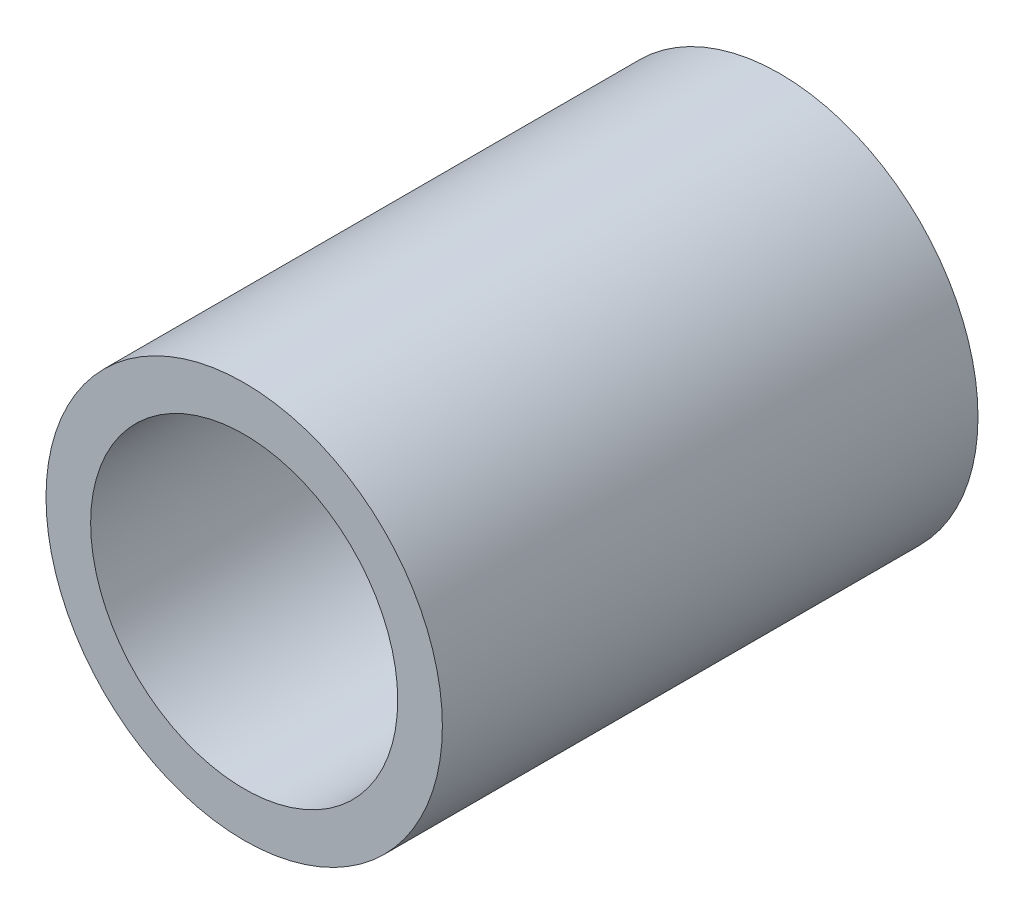
ISO-10303-21;
HEADER;
FILE_DESCRIPTION(('STEP AP214'),'2;1');
FILE_NAME('part.step','',(''),(''),'','','');
FILE_SCHEMA(('AUTOMOTIVE_DESIGN { 1 0 10303 214 1 1 1 1 }'));
ENDSEC;
DATA;
#1=APPLICATION_CONTEXT('core data for automotive mechanical design processes');
#2=APPLICATION_PROTOCOL_DEFINITION('international standard','automotive_design',2000,#1);
#3=PRODUCT_CONTEXT('',#1,'mechanical');
#4=PRODUCT('Part','Part','',(#3));
#5=PRODUCT_RELATED_PRODUCT_CATEGORY('part','',(#4));
#6=PRODUCT_DEFINITION_FORMATION('','',#4);
#7=PRODUCT_DEFINITION_CONTEXT('part definition',#1,'design');
#8=PRODUCT_DEFINITION('design','',#6,#7);
#9=PRODUCT_DEFINITION_SHAPE('','',#8);
#10=(LENGTH_UNIT() NAMED_UNIT(*) SI_UNIT(.MILLI.,.METRE.));
#11=(NAMED_UNIT(*) PLANE_ANGLE_UNIT() SI_UNIT($,.RADIAN.));
#12=(NAMED_UNIT(*) SI_UNIT($,.STERADIAN.) SOLID_ANGLE_UNIT());
#13=UNCERTAINTY_MEASURE_WITH_UNIT(LENGTH_MEASURE(1.E-05),#10,'distance_accuracy_value','');
#14=(GEOMETRIC_REPRESENTATION_CONTEXT(3) GLOBAL_UNCERTAINTY_ASSIGNED_CONTEXT((#13)) GLOBAL_UNIT_ASSIGNED_CONTEXT((#10,
#11,#12)) REPRESENTATION_CONTEXT('',''));
#15=CARTESIAN_POINT('',(0.,0.,0.));
#16=DIRECTION('',(0.,0.,1.));
#17=DIRECTION('',(1.,0.,0.));
#18=AXIS2_PLACEMENT_3D('',#15,#16,#17);
#19=CARTESIAN_POINT('',(0.,0.,60.));
#20=DIRECTION('',(0.,0.,1.));
#21=DIRECTION('',(1.,0.,0.));
#22=AXIS2_PLACEMENT_3D('',#19,#20,#21);
#23=PLANE('',#22);
#24=CARTESIAN_POINT('',(0.,0.,60.));
#25=DIRECTION('',(0.,0.,1.));
#26=DIRECTION('',(1.,0.,0.));
#27=AXIS2_PLACEMENT_3D('',#24,#25,#26);
#28=CIRCLE('',#27,22.2);
#29=CARTESIAN_POINT('',(22.2,0.,60.));
#30=VERTEX_POINT('',#29);
#31=EDGE_CURVE('E10',#30,#30,#28,.T.);
#32=ORIENTED_EDGE('',*,*,#31,.T.);
#33=EDGE_LOOP('',(#32));
#34=FACE_BOUND('',#33,.T.);
#35=CARTESIAN_POINT('',(0.,0.,60.));
#36=DIRECTION('',(0.,0.,1.));
#37=DIRECTION('',(1.,0.,0.));
#38=AXIS2_PLACEMENT_3D('',#35,#36,#37);
#39=CIRCLE('',#38,17.2);
#40=CARTESIAN_POINT('',(17.2,0.,60.));
#41=VERTEX_POINT('',#40);
#42=EDGE_CURVE('E42',#41,#41,#39,.T.);
#43=ORIENTED_EDGE('',*,*,#42,.F.);
#44=EDGE_LOOP('',(#43));
#45=FACE_BOUND('',#44,.T.);
#46=ADVANCED_FACE('F31',(#34,#45),#23,.T.);
#47=CARTESIAN_POINT('',(0.,0.,0.));
#48=DIRECTION('',(0.,0.,1.));
#49=DIRECTION('',(1.,0.,0.));
#50=AXIS2_PLACEMENT_3D('',#47,#48,#49);
#51=PLANE('',#50);
#52=CARTESIAN_POINT('',(0.,0.,0.));
#53=DIRECTION('',(0.,0.,1.));
#54=DIRECTION('',(1.,0.,0.));
#55=AXIS2_PLACEMENT_3D('',#52,#53,#54);
#56=CIRCLE('',#55,22.2);
#57=CARTESIAN_POINT('',(22.2,0.,0.));
#58=VERTEX_POINT('',#57);
#59=EDGE_CURVE('E35',#58,#58,#56,.T.);
#60=ORIENTED_EDGE('',*,*,#59,.F.);
#61=EDGE_LOOP('',(#60));
#62=FACE_BOUND('',#61,.T.);
#63=CARTESIAN_POINT('',(0.,0.,0.));
#64=DIRECTION('',(0.,0.,1.));
#65=DIRECTION('',(1.,0.,0.));
#66=AXIS2_PLACEMENT_3D('',#63,#64,#65);
#67=CIRCLE('',#66,17.2);
#68=CARTESIAN_POINT('',(17.2,0.,0.));
#69=VERTEX_POINT('',#68);
#70=EDGE_CURVE('E44',#69,#69,#67,.T.);
#71=ORIENTED_EDGE('',*,*,#70,.T.);
#72=EDGE_LOOP('',(#71));
#73=FACE_BOUND('',#72,.T.);
#74=ADVANCED_FACE('F54',(#62,#73),#51,.F.);
#75=CARTESIAN_POINT('',(0.,0.,60.));
#76=DIRECTION('',(0.,0.,-1.));
#77=DIRECTION('',(-1.,0.,0.));
#78=AXIS2_PLACEMENT_3D('',#75,#76,#77);
#79=CYLINDRICAL_SURFACE('',#78,22.2);
#80=ORIENTED_EDGE('',*,*,#31,.F.);
#81=EDGE_LOOP('',(#80));
#82=FACE_BOUND('',#81,.T.);
#83=ORIENTED_EDGE('',*,*,#59,.T.);
#84=EDGE_LOOP('',(#83));
#85=FACE_BOUND('',#84,.T.);
#86=ADVANCED_FACE('F33',(#82,#85),#79,.T.);
#87=CARTESIAN_POINT('',(0.,0.,60.));
#88=DIRECTION('',(0.,0.,-1.));
#89=DIRECTION('',(-1.,0.,0.));
#90=AXIS2_PLACEMENT_3D('',#87,#88,#89);
#91=CYLINDRICAL_SURFACE('',#90,17.2);
#92=ORIENTED_EDGE('',*,*,#42,.T.);
#93=EDGE_LOOP('',(#92));
#94=FACE_BOUND('',#93,.T.);
#95=ORIENTED_EDGE('',*,*,#70,.F.);
#96=EDGE_LOOP('',(#95));
#97=FACE_BOUND('',#96,.T.);
#98=ADVANCED_FACE('F50',(#94,#97),#91,.F.);
#99=CLOSED_SHELL('',(#46,#74,#86,#98));
#100=MANIFOLD_SOLID_BREP('B2',#99);
#101=ADVANCED_BREP_SHAPE_REPRESENTATION('',(#18,#100),#14);
#102=SHAPE_DEFINITION_REPRESENTATION(#9,#101);
ENDSEC;
END-ISO-10303-21;
